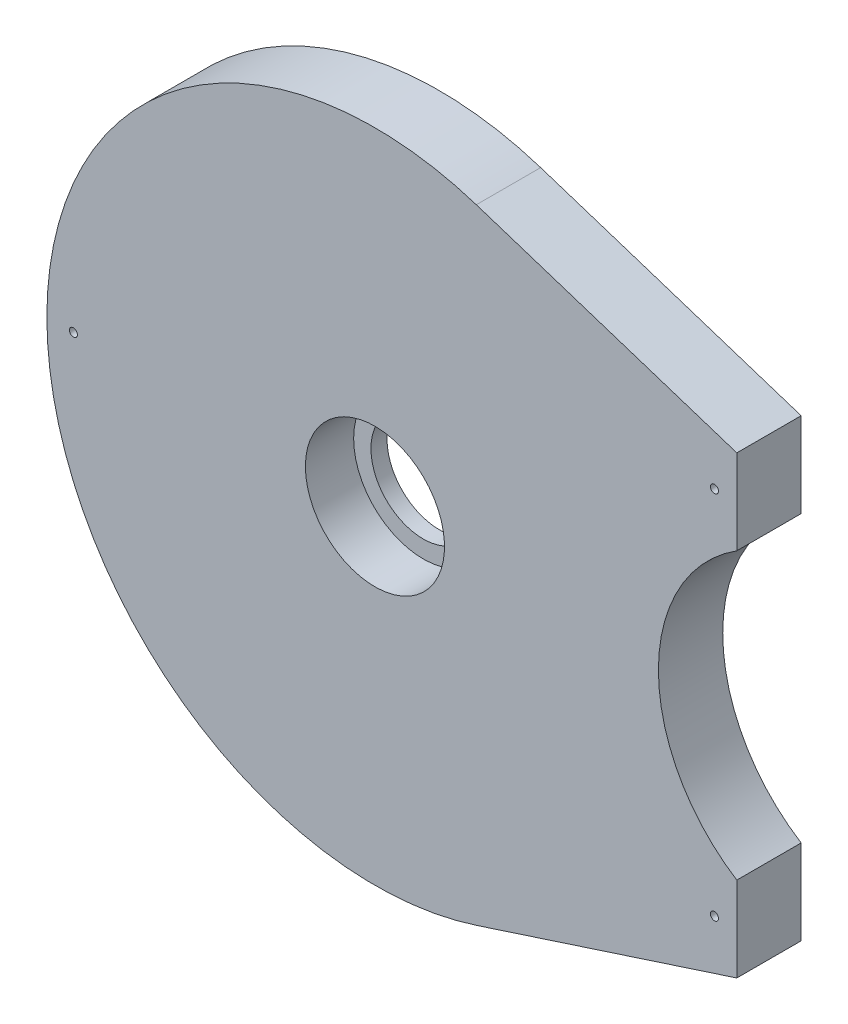
ISO-10303-21;
HEADER;
FILE_DESCRIPTION(('STEP AP214'),'2;1');
FILE_NAME('part.step','',(''),(''),'','','');
FILE_SCHEMA(('AUTOMOTIVE_DESIGN { 1 0 10303 214 1 1 1 1 }'));
ENDSEC;
DATA;
#1=APPLICATION_CONTEXT('core data for automotive mechanical design processes');
#2=APPLICATION_PROTOCOL_DEFINITION('international standard','automotive_design',2000,#1);
#3=PRODUCT_CONTEXT('',#1,'mechanical');
#4=PRODUCT('Part','Part','',(#3));
#5=PRODUCT_RELATED_PRODUCT_CATEGORY('part','',(#4));
#6=PRODUCT_DEFINITION_FORMATION('','',#4);
#7=PRODUCT_DEFINITION_CONTEXT('part definition',#1,'design');
#8=PRODUCT_DEFINITION('design','',#6,#7);
#9=PRODUCT_DEFINITION_SHAPE('','',#8);
#10=(LENGTH_UNIT() NAMED_UNIT(*) SI_UNIT(.MILLI.,.METRE.));
#11=(NAMED_UNIT(*) PLANE_ANGLE_UNIT() SI_UNIT($,.RADIAN.));
#12=(NAMED_UNIT(*) SI_UNIT($,.STERADIAN.) SOLID_ANGLE_UNIT());
#13=UNCERTAINTY_MEASURE_WITH_UNIT(LENGTH_MEASURE(1.E-05),#10,'distance_accuracy_value','');
#14=(GEOMETRIC_REPRESENTATION_CONTEXT(3) GLOBAL_UNCERTAINTY_ASSIGNED_CONTEXT((#13)) GLOBAL_UNIT_ASSIGNED_CONTEXT((#10,
#11,#12)) REPRESENTATION_CONTEXT('',''));
#15=CARTESIAN_POINT('',(0.,0.,0.));
#16=DIRECTION('',(0.,0.,1.));
#17=DIRECTION('',(1.,0.,0.));
#18=AXIS2_PLACEMENT_3D('',#15,#16,#17);
#19=CARTESIAN_POINT('',(45.,0.,88.0950216774435));
#20=DIRECTION('',(1.,0.,0.));
#21=DIRECTION('',(0.,1.,0.));
#22=AXIS2_PLACEMENT_3D('',#19,#20,#21);
#23=PLANE('',#22);
#24=DIRECTION('',(0.,0.,-1.));
#25=VECTOR('',#24,1.);
#26=CARTESIAN_POINT('',(45.,-17.7323856263053,6.));
#27=LINE('',#26,#25);
#28=CARTESIAN_POINT('',(45.,-17.7323856263053,4.));
#29=VERTEX_POINT('',#28);
#30=CARTESIAN_POINT('',(45.,-17.7323856263053,-4.));
#31=VERTEX_POINT('',#30);
#32=EDGE_CURVE('E11',#29,#31,#27,.T.);
#33=ORIENTED_EDGE('',*,*,#32,.F.);
#34=DIRECTION('',(0.,-1.,0.));
#35=VECTOR('',#34,1.);
#36=CARTESIAN_POINT('',(45.,0.,4.));
#37=LINE('',#36,#35);
#38=CARTESIAN_POINT('',(45.,-28.2782724184407,4.));
#39=VERTEX_POINT('',#38);
#40=EDGE_CURVE('E131',#29,#39,#37,.T.);
#41=ORIENTED_EDGE('',*,*,#40,.T.);
#42=DIRECTION('',(0.,0.,-1.));
#43=VECTOR('',#42,1.);
#44=CARTESIAN_POINT('',(45.,-28.2782724184407,88.0950216774435));
#45=LINE('',#44,#43);
#46=CARTESIAN_POINT('',(45.,-28.2782724184407,-4.));
#47=VERTEX_POINT('',#46);
#48=EDGE_CURVE('E111',#39,#47,#45,.T.);
#49=ORIENTED_EDGE('',*,*,#48,.T.);
#50=DIRECTION('',(0.,-1.,0.));
#51=VECTOR('',#50,1.);
#52=CARTESIAN_POINT('',(45.,0.,-4.));
#53=LINE('',#52,#51);
#54=EDGE_CURVE('E104',#31,#47,#53,.T.);
#55=ORIENTED_EDGE('',*,*,#54,.F.);
#56=EDGE_LOOP('',(#33,#41,#49,#55));
#57=FACE_BOUND('',#56,.T.);
#58=ADVANCED_FACE('F41',(#57),#23,.T.);
#59=CARTESIAN_POINT('',(0.,0.,4.));
#60=DIRECTION('',(0.,0.,-1.));
#61=DIRECTION('',(-1.,0.,0.));
#62=AXIS2_PLACEMENT_3D('',#59,#60,#61);
#63=CYLINDRICAL_SURFACE('',#62,40.8);
#64=DIRECTION('',(0.,0.,-1.));
#65=VECTOR('',#64,1.);
#66=CARTESIAN_POINT('',(12.6078933704976,-38.8031058648423,88.0950216774435));
#67=LINE('',#66,#65);
#68=CARTESIAN_POINT('',(12.6078933704976,-38.8031058648423,4.));
#69=VERTEX_POINT('',#68);
#70=CARTESIAN_POINT('',(12.6078933704976,-38.8031058648423,-4.));
#71=VERTEX_POINT('',#70);
#72=EDGE_CURVE('E135',#69,#71,#67,.T.);
#73=ORIENTED_EDGE('',*,*,#72,.F.);
#74=CARTESIAN_POINT('',(0.,0.,4.));
#75=DIRECTION('',(0.,0.,1.));
#76=DIRECTION('',(1.,0.,0.));
#77=AXIS2_PLACEMENT_3D('',#74,#75,#76);
#78=CIRCLE('',#77,40.8);
#79=CARTESIAN_POINT('',(12.6078933704976,38.8031058648423,4.));
#80=VERTEX_POINT('',#79);
#81=EDGE_CURVE('E152',#80,#69,#78,.T.);
#82=ORIENTED_EDGE('',*,*,#81,.F.);
#83=DIRECTION('',(0.,0.,-1.));
#84=VECTOR('',#83,1.);
#85=CARTESIAN_POINT('',(12.6078933704976,38.8031058648423,88.0950216774435));
#86=LINE('',#85,#84);
#87=CARTESIAN_POINT('',(12.6078933704976,38.8031058648423,-4.));
#88=VERTEX_POINT('',#87);
#89=EDGE_CURVE('E113',#80,#88,#86,.T.);
#90=ORIENTED_EDGE('',*,*,#89,.T.);
#91=CARTESIAN_POINT('',(0.,0.,-4.));
#92=DIRECTION('',(0.,0.,1.));
#93=DIRECTION('',(1.,0.,0.));
#94=AXIS2_PLACEMENT_3D('',#91,#92,#93);
#95=CIRCLE('',#94,40.8);
#96=EDGE_CURVE('E65',#88,#71,#95,.T.);
#97=ORIENTED_EDGE('',*,*,#96,.T.);
#98=EDGE_LOOP('',(#73,#82,#90,#97));
#99=FACE_BOUND('',#98,.T.);
#100=ADVANCED_FACE('F43',(#99),#63,.T.);
#101=CARTESIAN_POINT('',(0.,0.,-4.));
#102=DIRECTION('',(0.,0.,1.));
#103=DIRECTION('',(1.,0.,0.));
#104=AXIS2_PLACEMENT_3D('',#101,#102,#103);
#105=PLANE('',#104);
#106=CARTESIAN_POINT('',(42.2195587812947,23.005329022373,-4.));
#107=DIRECTION('',(0.,0.,-1.));
#108=DIRECTION('',(-1.,0.,0.));
#109=AXIS2_PLACEMENT_3D('',#106,#107,#108);
#110=CIRCLE('',#109,0.499999999999999);
#111=CARTESIAN_POINT('',(41.7195587812947,23.005329022373,-4.));
#112=VERTEX_POINT('',#111);
#113=EDGE_CURVE('E164',#112,#112,#110,.T.);
#114=ORIENTED_EDGE('',*,*,#113,.F.);
#115=EDGE_LOOP('',(#114));
#116=FACE_BOUND('',#115,.T.);
#117=CARTESIAN_POINT('',(42.2195587812947,-23.005329022373,-4.));
#118=DIRECTION('',(0.,0.,-1.));
#119=DIRECTION('',(-1.,0.,0.));
#120=AXIS2_PLACEMENT_3D('',#117,#118,#119);
#121=CIRCLE('',#120,0.499999999999999);
#122=CARTESIAN_POINT('',(41.7195587812947,-23.005329022373,-4.));
#123=VERTEX_POINT('',#122);
#124=EDGE_CURVE('E250',#123,#123,#121,.T.);
#125=ORIENTED_EDGE('',*,*,#124,.F.);
#126=EDGE_LOOP('',(#125));
#127=FACE_BOUND('',#126,.T.);
#128=CARTESIAN_POINT('',(-37.5,0.,-4.));
#129=DIRECTION('',(0.,0.,-1.));
#130=DIRECTION('',(-1.,0.,0.));
#131=AXIS2_PLACEMENT_3D('',#128,#129,#130);
#132=CIRCLE('',#131,0.499999999999999);
#133=CARTESIAN_POINT('',(-38.,0.,-4.));
#134=VERTEX_POINT('',#133);
#135=EDGE_CURVE('E253',#134,#134,#132,.T.);
#136=ORIENTED_EDGE('',*,*,#135,.F.);
#137=EDGE_LOOP('',(#136));
#138=FACE_BOUND('',#137,.T.);
#139=CARTESIAN_POINT('',(45.,28.2782724184407,-4.));
#140=VERTEX_POINT('',#139);
#141=CARTESIAN_POINT('',(45.,17.7323856263053,-4.));
#142=VERTEX_POINT('',#141);
#143=EDGE_CURVE('E108',#140,#142,#53,.T.);
#144=ORIENTED_EDGE('',*,*,#143,.T.);
#145=CARTESIAN_POINT('',(56.25,0.,-4.));
#146=DIRECTION('',(0.,0.,-1.));
#147=DIRECTION('',(-1.,0.,0.));
#148=AXIS2_PLACEMENT_3D('',#145,#146,#147);
#149=CIRCLE('',#148,21.);
#150=EDGE_CURVE('E57',#31,#142,#149,.T.);
#151=ORIENTED_EDGE('',*,*,#150,.F.);
#152=ORIENTED_EDGE('',*,*,#54,.T.);
#153=DIRECTION('',(-0.951056516295156,-0.309016994374941,0.));
#154=VECTOR('',#153,1.);
#155=CARTESIAN_POINT('',(12.6078933704976,-38.8031058648423,-4.));
#156=LINE('',#155,#154);
#157=EDGE_CURVE('E115',#47,#71,#156,.T.);
#158=ORIENTED_EDGE('',*,*,#157,.T.);
#159=ORIENTED_EDGE('',*,*,#96,.F.);
#160=DIRECTION('',(-0.951056516295155,0.309016994374942,0.));
#161=VECTOR('',#160,1.);
#162=CARTESIAN_POINT('',(12.6078933704976,38.8031058648423,-4.));
#163=LINE('',#162,#161);
#164=EDGE_CURVE('E116',#140,#88,#163,.T.);
#165=ORIENTED_EDGE('',*,*,#164,.F.);
#166=EDGE_LOOP('',(#144,#151,#152,#158,#159,#165));
#167=FACE_BOUND('',#166,.T.);
#168=CARTESIAN_POINT('',(0.,0.,-4.));
#169=DIRECTION('',(0.,0.,1.));
#170=DIRECTION('',(1.,0.,0.));
#171=AXIS2_PLACEMENT_3D('',#168,#169,#170);
#172=CIRCLE('',#171,33.9870554062488);
#173=CARTESIAN_POINT('',(33.9870554062488,0.,-4.));
#174=VERTEX_POINT('',#173);
#175=EDGE_CURVE('E143',#174,#174,#172,.T.);
#176=ORIENTED_EDGE('',*,*,#175,.T.);
#177=EDGE_LOOP('',(#176));
#178=FACE_BOUND('',#177,.T.);
#179=ADVANCED_FACE('F101',(#116,#127,#138,#167,#178),#105,.F.);
#180=CARTESIAN_POINT('',(0.,0.,-4.));
#181=DIRECTION('',(0.,0.,-1.));
#182=DIRECTION('',(-1.,0.,0.));
#183=AXIS2_PLACEMENT_3D('',#180,#181,#182);
#184=CIRCLE('',#183,6.5);
#185=CARTESIAN_POINT('',(-6.5,0.,-4.));
#186=VERTEX_POINT('',#185);
#187=EDGE_CURVE('E139',#186,#186,#184,.T.);
#188=ORIENTED_EDGE('',*,*,#187,.F.);
#189=EDGE_LOOP('',(#188));
#190=FACE_BOUND('',#189,.T.);
#191=CARTESIAN_POINT('',(0.,0.,-4.));
#192=DIRECTION('',(0.,0.,-1.));
#193=DIRECTION('',(-1.,0.,0.));
#194=AXIS2_PLACEMENT_3D('',#191,#192,#193);
#195=CIRCLE('',#194,28.0129445937512);
#196=CARTESIAN_POINT('',(-28.0129445937512,0.,-4.));
#197=VERTEX_POINT('',#196);
#198=EDGE_CURVE('E127',#197,#197,#195,.T.);
#199=ORIENTED_EDGE('',*,*,#198,.T.);
#200=EDGE_LOOP('',(#199));
#201=FACE_BOUND('',#200,.T.);
#202=ADVANCED_FACE('F178',(#190,#201),#105,.F.);
#203=CARTESIAN_POINT('',(0.,0.,4.));
#204=DIRECTION('',(0.,0.,1.));
#205=DIRECTION('',(1.,0.,0.));
#206=AXIS2_PLACEMENT_3D('',#203,#204,#205);
#207=PLANE('',#206);
#208=CARTESIAN_POINT('',(42.2195587812947,23.005329022373,4.));
#209=DIRECTION('',(0.,0.,1.));
#210=DIRECTION('',(1.,0.,0.));
#211=AXIS2_PLACEMENT_3D('',#208,#209,#210);
#212=CIRCLE('',#211,0.499999999999999);
#213=CARTESIAN_POINT('',(42.7195587812947,23.005329022373,4.));
#214=VERTEX_POINT('',#213);
#215=EDGE_CURVE('E45',#214,#214,#212,.T.);
#216=ORIENTED_EDGE('',*,*,#215,.F.);
#217=EDGE_LOOP('',(#216));
#218=FACE_BOUND('',#217,.T.);
#219=CARTESIAN_POINT('',(42.2195587812947,-23.005329022373,4.));
#220=DIRECTION('',(0.,0.,1.));
#221=DIRECTION('',(1.,0.,0.));
#222=AXIS2_PLACEMENT_3D('',#219,#220,#221);
#223=CIRCLE('',#222,0.499999999999999);
#224=CARTESIAN_POINT('',(42.7195587812947,-23.005329022373,4.));
#225=VERTEX_POINT('',#224);
#226=EDGE_CURVE('E163',#225,#225,#223,.T.);
#227=ORIENTED_EDGE('',*,*,#226,.F.);
#228=EDGE_LOOP('',(#227));
#229=FACE_BOUND('',#228,.T.);
#230=CARTESIAN_POINT('',(-37.5,0.,4.));
#231=DIRECTION('',(0.,0.,1.));
#232=DIRECTION('',(1.,0.,0.));
#233=AXIS2_PLACEMENT_3D('',#230,#231,#232);
#234=CIRCLE('',#233,0.499999999999999);
#235=CARTESIAN_POINT('',(-37.,0.,4.));
#236=VERTEX_POINT('',#235);
#237=EDGE_CURVE('E161',#236,#236,#234,.T.);
#238=ORIENTED_EDGE('',*,*,#237,.F.);
#239=EDGE_LOOP('',(#238));
#240=FACE_BOUND('',#239,.T.);
#241=CARTESIAN_POINT('',(56.25,0.,4.));
#242=DIRECTION('',(0.,0.,1.));
#243=DIRECTION('',(1.,0.,0.));
#244=AXIS2_PLACEMENT_3D('',#241,#242,#243);
#245=CIRCLE('',#244,21.);
#246=CARTESIAN_POINT('',(45.,17.7323856263053,4.));
#247=VERTEX_POINT('',#246);
#248=EDGE_CURVE('E95',#247,#29,#245,.T.);
#249=ORIENTED_EDGE('',*,*,#248,.F.);
#250=CARTESIAN_POINT('',(45.,28.2782724184407,4.));
#251=VERTEX_POINT('',#250);
#252=EDGE_CURVE('E128',#251,#247,#37,.T.);
#253=ORIENTED_EDGE('',*,*,#252,.F.);
#254=DIRECTION('',(-0.951056516295156,0.309016994374942,0.));
#255=VECTOR('',#254,1.);
#256=CARTESIAN_POINT('',(12.6078933704976,38.8031058648423,4.));
#257=LINE('',#256,#255);
#258=EDGE_CURVE('E124',#251,#80,#257,.T.);
#259=ORIENTED_EDGE('',*,*,#258,.T.);
#260=ORIENTED_EDGE('',*,*,#81,.T.);
#261=DIRECTION('',(-0.951056516295156,-0.309016994374941,0.));
#262=VECTOR('',#261,1.);
#263=CARTESIAN_POINT('',(12.6078933704976,-38.8031058648423,4.));
#264=LINE('',#263,#262);
#265=EDGE_CURVE('E132',#39,#69,#264,.T.);
#266=ORIENTED_EDGE('',*,*,#265,.F.);
#267=ORIENTED_EDGE('',*,*,#40,.F.);
#268=EDGE_LOOP('',(#249,#253,#259,#260,#266,#267));
#269=FACE_BOUND('',#268,.T.);
#270=CARTESIAN_POINT('',(0.,0.,4.));
#271=DIRECTION('',(0.,0.,-1.));
#272=DIRECTION('',(-1.,0.,0.));
#273=AXIS2_PLACEMENT_3D('',#270,#271,#272);
#274=CIRCLE('',#273,8.65);
#275=CARTESIAN_POINT('',(-8.65,0.,4.));
#276=VERTEX_POINT('',#275);
#277=EDGE_CURVE('E149',#276,#276,#274,.T.);
#278=ORIENTED_EDGE('',*,*,#277,.T.);
#279=EDGE_LOOP('',(#278));
#280=FACE_BOUND('',#279,.T.);
#281=ADVANCED_FACE('F174',(#218,#229,#240,#269,#280),#207,.T.);
#282=CARTESIAN_POINT('',(0.,0.,-4.));
#283=DIRECTION('',(0.,0.,-1.));
#284=DIRECTION('',(-1.,0.,0.));
#285=AXIS2_PLACEMENT_3D('',#282,#283,#284);
#286=CYLINDRICAL_SURFACE('',#285,8.65);
#287=CARTESIAN_POINT('',(0.,0.,-2.));
#288=DIRECTION('',(0.,0.,-1.));
#289=DIRECTION('',(-1.,0.,0.));
#290=AXIS2_PLACEMENT_3D('',#287,#288,#289);
#291=CIRCLE('',#290,8.65);
#292=CARTESIAN_POINT('',(-8.65,0.,-2.));
#293=VERTEX_POINT('',#292);
#294=EDGE_CURVE('E146',#293,#293,#291,.T.);
#295=ORIENTED_EDGE('',*,*,#294,.T.);
#296=EDGE_LOOP('',(#295));
#297=FACE_BOUND('',#296,.T.);
#298=ORIENTED_EDGE('',*,*,#277,.F.);
#299=EDGE_LOOP('',(#298));
#300=FACE_BOUND('',#299,.T.);
#301=ADVANCED_FACE('F177',(#297,#300),#286,.F.);
#302=CARTESIAN_POINT('',(8.65,0.,-2.));
#303=DIRECTION('',(0.,0.,1.));
#304=DIRECTION('',(1.,0.,0.));
#305=AXIS2_PLACEMENT_3D('',#302,#303,#304);
#306=PLANE('',#305);
#307=CARTESIAN_POINT('',(0.,0.,-2.));
#308=DIRECTION('',(0.,0.,-1.));
#309=DIRECTION('',(-1.,0.,0.));
#310=AXIS2_PLACEMENT_3D('',#307,#308,#309);
#311=CIRCLE('',#310,6.5);
#312=CARTESIAN_POINT('',(-6.5,0.,-2.));
#313=VERTEX_POINT('',#312);
#314=EDGE_CURVE('E142',#313,#313,#311,.T.);
#315=ORIENTED_EDGE('',*,*,#314,.T.);
#316=EDGE_LOOP('',(#315));
#317=FACE_BOUND('',#316,.T.);
#318=ORIENTED_EDGE('',*,*,#294,.F.);
#319=EDGE_LOOP('',(#318));
#320=FACE_BOUND('',#319,.T.);
#321=ADVANCED_FACE('F188',(#317,#320),#306,.T.);
#322=CARTESIAN_POINT('',(0.,0.,-4.));
#323=DIRECTION('',(0.,0.,-1.));
#324=DIRECTION('',(-1.,0.,0.));
#325=AXIS2_PLACEMENT_3D('',#322,#323,#324);
#326=CYLINDRICAL_SURFACE('',#325,6.5);
#327=ORIENTED_EDGE('',*,*,#187,.T.);
#328=EDGE_LOOP('',(#327));
#329=FACE_BOUND('',#328,.T.);
#330=ORIENTED_EDGE('',*,*,#314,.F.);
#331=EDGE_LOOP('',(#330));
#332=FACE_BOUND('',#331,.T.);
#333=ADVANCED_FACE('F194',(#329,#332),#326,.F.);
#334=CARTESIAN_POINT('',(0.,0.,-5.));
#335=DIRECTION('',(0.,0.,1.));
#336=DIRECTION('',(1.,0.,0.));
#337=AXIS2_PLACEMENT_3D('',#334,#335,#336);
#338=TOROIDAL_SURFACE('',#337,31.,3.15);
#339=ORIENTED_EDGE('',*,*,#198,.F.);
#340=EDGE_LOOP('',(#339));
#341=FACE_BOUND('',#340,.T.);
#342=ORIENTED_EDGE('',*,*,#175,.F.);
#343=EDGE_LOOP('',(#342));
#344=FACE_BOUND('',#343,.T.);
#345=ADVANCED_FACE('F214',(#341,#344),#338,.F.);
#346=CARTESIAN_POINT('',(12.6078933704976,-38.8031058648423,88.0950216774435));
#347=DIRECTION('',(0.309016994374941,-0.951056516295156,0.));
#348=DIRECTION('',(0.951056516295156,0.309016994374941,0.));
#349=AXIS2_PLACEMENT_3D('',#346,#347,#348);
#350=PLANE('',#349);
#351=ORIENTED_EDGE('',*,*,#48,.F.);
#352=ORIENTED_EDGE('',*,*,#265,.T.);
#353=ORIENTED_EDGE('',*,*,#72,.T.);
#354=ORIENTED_EDGE('',*,*,#157,.F.);
#355=EDGE_LOOP('',(#351,#352,#353,#354));
#356=FACE_BOUND('',#355,.T.);
#357=ADVANCED_FACE('F207',(#356),#350,.T.);
#358=DIRECTION('',(0.,0.,-1.));
#359=VECTOR('',#358,1.);
#360=CARTESIAN_POINT('',(45.,17.7323856263053,6.));
#361=LINE('',#360,#359);
#362=EDGE_CURVE('E50',#142,#247,#361,.F.);
#363=ORIENTED_EDGE('',*,*,#362,.F.);
#364=ORIENTED_EDGE('',*,*,#143,.F.);
#365=DIRECTION('',(0.,0.,-1.));
#366=VECTOR('',#365,1.);
#367=CARTESIAN_POINT('',(45.,28.2782724184407,88.0950216774435));
#368=LINE('',#367,#366);
#369=EDGE_CURVE('E123',#251,#140,#368,.T.);
#370=ORIENTED_EDGE('',*,*,#369,.F.);
#371=ORIENTED_EDGE('',*,*,#252,.T.);
#372=EDGE_LOOP('',(#363,#364,#370,#371));
#373=FACE_BOUND('',#372,.T.);
#374=ADVANCED_FACE('F199',(#373),#23,.T.);
#375=CARTESIAN_POINT('',(12.6078933704976,38.8031058648423,88.0950216774435));
#376=DIRECTION('',(-0.309016994374942,-0.951056516295156,0.));
#377=DIRECTION('',(0.951056516295156,-0.309016994374942,0.));
#378=AXIS2_PLACEMENT_3D('',#375,#376,#377);
#379=PLANE('',#378);
#380=ORIENTED_EDGE('',*,*,#258,.F.);
#381=ORIENTED_EDGE('',*,*,#369,.T.);
#382=ORIENTED_EDGE('',*,*,#164,.T.);
#383=ORIENTED_EDGE('',*,*,#89,.F.);
#384=EDGE_LOOP('',(#380,#381,#382,#383));
#385=FACE_BOUND('',#384,.T.);
#386=ADVANCED_FACE('F206',(#385),#379,.F.);
#387=CARTESIAN_POINT('',(56.25,0.,6.));
#388=DIRECTION('',(0.,0.,-1.));
#389=DIRECTION('',(-1.,0.,0.));
#390=AXIS2_PLACEMENT_3D('',#387,#388,#389);
#391=CYLINDRICAL_SURFACE('',#390,21.);
#392=ORIENTED_EDGE('',*,*,#32,.T.);
#393=ORIENTED_EDGE('',*,*,#150,.T.);
#394=ORIENTED_EDGE('',*,*,#362,.T.);
#395=ORIENTED_EDGE('',*,*,#248,.T.);
#396=EDGE_LOOP('',(#392,#393,#394,#395));
#397=FACE_BOUND('',#396,.T.);
#398=ADVANCED_FACE('F93',(#397),#391,.F.);
#399=CARTESIAN_POINT('',(-37.5,0.,6.));
#400=DIRECTION('',(0.,0.,-1.));
#401=DIRECTION('',(-1.,0.,0.));
#402=AXIS2_PLACEMENT_3D('',#399,#400,#401);
#403=CYLINDRICAL_SURFACE('',#402,0.499999999999999);
#404=ORIENTED_EDGE('',*,*,#237,.T.);
#405=EDGE_LOOP('',(#404));
#406=FACE_BOUND('',#405,.T.);
#407=ORIENTED_EDGE('',*,*,#135,.T.);
#408=EDGE_LOOP('',(#407));
#409=FACE_BOUND('',#408,.T.);
#410=ADVANCED_FACE('F264',(#406,#409),#403,.F.);
#411=CARTESIAN_POINT('',(42.2195587812947,-23.005329022373,6.));
#412=DIRECTION('',(0.,0.,-1.));
#413=DIRECTION('',(-1.,0.,0.));
#414=AXIS2_PLACEMENT_3D('',#411,#412,#413);
#415=CYLINDRICAL_SURFACE('',#414,0.499999999999999);
#416=ORIENTED_EDGE('',*,*,#226,.T.);
#417=EDGE_LOOP('',(#416));
#418=FACE_BOUND('',#417,.T.);
#419=ORIENTED_EDGE('',*,*,#124,.T.);
#420=EDGE_LOOP('',(#419));
#421=FACE_BOUND('',#420,.T.);
#422=ADVANCED_FACE('F259',(#418,#421),#415,.F.);
#423=CARTESIAN_POINT('',(42.2195587812947,23.005329022373,6.));
#424=DIRECTION('',(0.,0.,-1.));
#425=DIRECTION('',(-1.,0.,0.));
#426=AXIS2_PLACEMENT_3D('',#423,#424,#425);
#427=CYLINDRICAL_SURFACE('',#426,0.499999999999999);
#428=ORIENTED_EDGE('',*,*,#215,.T.);
#429=EDGE_LOOP('',(#428));
#430=FACE_BOUND('',#429,.T.);
#431=ORIENTED_EDGE('',*,*,#113,.T.);
#432=EDGE_LOOP('',(#431));
#433=FACE_BOUND('',#432,.T.);
#434=ADVANCED_FACE('F171',(#430,#433),#427,.F.);
#435=CLOSED_SHELL('',(#58,#100,#179,#202,#281,#301,#321,#333,#345,#357,#374,#386,#398,#410,#422,#434));
#436=MANIFOLD_SOLID_BREP('B2',#435);
#437=ADVANCED_BREP_SHAPE_REPRESENTATION('',(#18,#436),#14);
#438=SHAPE_DEFINITION_REPRESENTATION(#9,#437);
ENDSEC;
END-ISO-10303-21;
